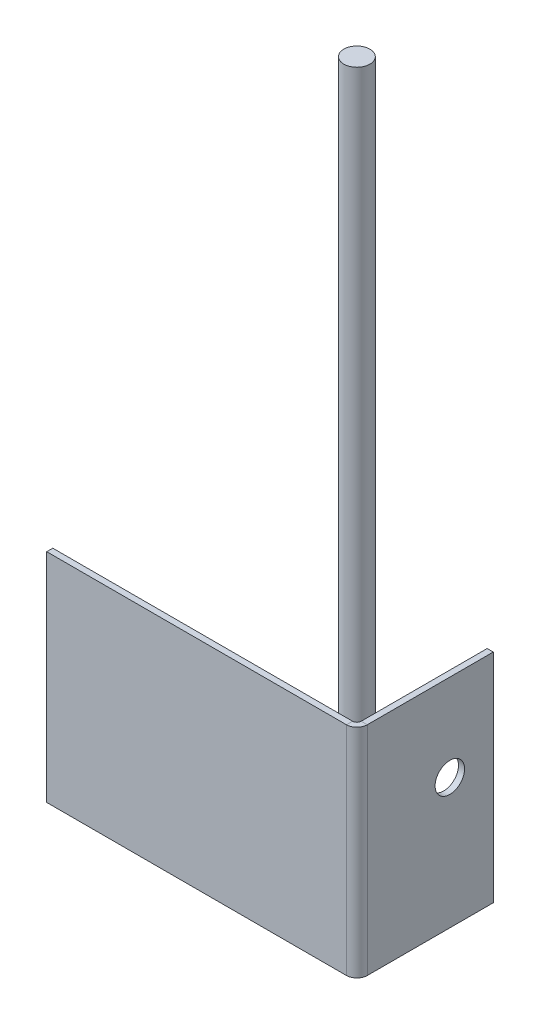
ISO-10303-21;
HEADER;
FILE_DESCRIPTION(('STEP AP214'),'2;1');
FILE_NAME('part.step','',(''),(''),'','','');
FILE_SCHEMA(('AUTOMOTIVE_DESIGN { 1 0 10303 214 1 1 1 1 }'));
ENDSEC;
DATA;
#1=APPLICATION_CONTEXT('core data for automotive mechanical design processes');
#2=APPLICATION_PROTOCOL_DEFINITION('international standard','automotive_design',2000,#1);
#3=PRODUCT_CONTEXT('',#1,'mechanical');
#4=PRODUCT('Part','Part','',(#3));
#5=PRODUCT_RELATED_PRODUCT_CATEGORY('part','',(#4));
#6=PRODUCT_DEFINITION_FORMATION('','',#4);
#7=PRODUCT_DEFINITION_CONTEXT('part definition',#1,'design');
#8=PRODUCT_DEFINITION('design','',#6,#7);
#9=PRODUCT_DEFINITION_SHAPE('','',#8);
#10=(LENGTH_UNIT() NAMED_UNIT(*) SI_UNIT(.MILLI.,.METRE.));
#11=(NAMED_UNIT(*) PLANE_ANGLE_UNIT() SI_UNIT($,.RADIAN.));
#12=(NAMED_UNIT(*) SI_UNIT($,.STERADIAN.) SOLID_ANGLE_UNIT());
#13=UNCERTAINTY_MEASURE_WITH_UNIT(LENGTH_MEASURE(1.E-05),#10,'distance_accuracy_value','');
#14=(GEOMETRIC_REPRESENTATION_CONTEXT(3) GLOBAL_UNCERTAINTY_ASSIGNED_CONTEXT((#13)) GLOBAL_UNIT_ASSIGNED_CONTEXT((#10,
#11,#12)) REPRESENTATION_CONTEXT('',''));
#15=CARTESIAN_POINT('',(0.,0.,0.));
#16=DIRECTION('',(0.,0.,1.));
#17=DIRECTION('',(1.,0.,0.));
#18=AXIS2_PLACEMENT_3D('',#15,#16,#17);
#19=CARTESIAN_POINT('',(16.,77.5,-2.2));
#20=DIRECTION('',(0.,-1.,0.));
#21=DIRECTION('',(0.,0.,-1.));
#22=AXIS2_PLACEMENT_3D('',#19,#20,#21);
#23=CYLINDRICAL_SURFACE('',#22,1.5);
#24=CARTESIAN_POINT('',(16.,77.5,-2.2));
#25=DIRECTION('',(0.,1.,0.));
#26=DIRECTION('',(0.,0.,1.));
#27=AXIS2_PLACEMENT_3D('',#24,#25,#26);
#28=CIRCLE('',#27,1.5);
#29=CARTESIAN_POINT('',(16.,77.5,-3.7));
#30=VERTEX_POINT('',#29);
#31=EDGE_CURVE('E11',#30,#30,#28,.T.);
#32=CARTESIAN_POINT('',(16.,-12.5,-2.2));
#33=DIRECTION('',(0.,1.,0.));
#34=DIRECTION('',(0.,0.,1.));
#35=AXIS2_PLACEMENT_3D('',#32,#33,#34);
#36=CIRCLE('',#35,1.5);
#37=CARTESIAN_POINT('',(16.,-12.5,-3.7));
#38=VERTEX_POINT('',#37);
#39=EDGE_CURVE('E49',#38,#38,#36,.T.);
#40=CARTESIAN_POINT('',(16.,77.5,-3.7));
#41=CARTESIAN_POINT('',(16.,76.5625,-3.7));
#42=CARTESIAN_POINT('',(16.,75.625,-3.7));
#43=CARTESIAN_POINT('',(16.,73.75,-3.7));
#44=CARTESIAN_POINT('',(16.,72.8125,-3.7));
#45=CARTESIAN_POINT('',(16.,70.9375,-3.7));
#46=CARTESIAN_POINT('',(16.,70.,-3.7));
#47=CARTESIAN_POINT('',(16.,68.125,-3.7));
#48=CARTESIAN_POINT('',(16.,67.1875,-3.7));
#49=CARTESIAN_POINT('',(16.,65.3125,-3.7));
#50=CARTESIAN_POINT('',(16.,64.375,-3.7));
#51=CARTESIAN_POINT('',(16.,62.5,-3.7));
#52=CARTESIAN_POINT('',(16.,61.5625,-3.7));
#53=CARTESIAN_POINT('',(16.,59.6875,-3.7));
#54=CARTESIAN_POINT('',(16.,58.75,-3.7));
#55=CARTESIAN_POINT('',(16.,56.875,-3.7));
#56=CARTESIAN_POINT('',(16.,55.9375,-3.7));
#57=CARTESIAN_POINT('',(16.,54.0625,-3.7));
#58=CARTESIAN_POINT('',(16.,53.125,-3.7));
#59=CARTESIAN_POINT('',(16.,51.25,-3.7));
#60=CARTESIAN_POINT('',(16.,50.3125,-3.7));
#61=CARTESIAN_POINT('',(16.,48.4375,-3.7));
#62=CARTESIAN_POINT('',(16.,47.5,-3.7));
#63=CARTESIAN_POINT('',(16.,45.625,-3.7));
#64=CARTESIAN_POINT('',(16.,44.6875,-3.7));
#65=CARTESIAN_POINT('',(16.,42.8125,-3.7));
#66=CARTESIAN_POINT('',(16.,41.875,-3.7));
#67=CARTESIAN_POINT('',(16.,40.,-3.7));
#68=CARTESIAN_POINT('',(16.,39.0625,-3.7));
#69=CARTESIAN_POINT('',(16.,37.1875,-3.7));
#70=CARTESIAN_POINT('',(16.,36.25,-3.7));
#71=CARTESIAN_POINT('',(16.,34.375,-3.7));
#72=CARTESIAN_POINT('',(16.,33.4375,-3.7));
#73=CARTESIAN_POINT('',(16.,31.5625,-3.7));
#74=CARTESIAN_POINT('',(16.,30.625,-3.7));
#75=CARTESIAN_POINT('',(16.,28.75,-3.7));
#76=CARTESIAN_POINT('',(16.,27.8125,-3.7));
#77=CARTESIAN_POINT('',(16.,25.9375,-3.7));
#78=CARTESIAN_POINT('',(16.,25.,-3.7));
#79=CARTESIAN_POINT('',(16.,23.125,-3.7));
#80=CARTESIAN_POINT('',(16.,22.1875,-3.7));
#81=CARTESIAN_POINT('',(16.,20.3125,-3.7));
#82=CARTESIAN_POINT('',(16.,19.375,-3.7));
#83=CARTESIAN_POINT('',(16.,17.5,-3.7));
#84=CARTESIAN_POINT('',(16.,16.5625,-3.7));
#85=CARTESIAN_POINT('',(16.,14.6875,-3.7));
#86=CARTESIAN_POINT('',(16.,13.75,-3.7));
#87=CARTESIAN_POINT('',(16.,11.875,-3.7));
#88=CARTESIAN_POINT('',(16.,10.9375,-3.7));
#89=CARTESIAN_POINT('',(16.,9.0625,-3.7));
#90=CARTESIAN_POINT('',(16.,8.125,-3.7));
#91=CARTESIAN_POINT('',(16.,6.25,-3.7));
#92=CARTESIAN_POINT('',(16.,5.31249999999999,-3.7));
#93=CARTESIAN_POINT('',(16.,3.43749999999999,-3.7));
#94=CARTESIAN_POINT('',(16.,2.49999999999999,-3.7));
#95=CARTESIAN_POINT('',(16.,0.624999999999996,-3.7));
#96=CARTESIAN_POINT('',(16.,-0.312500000000003,-3.7));
#97=CARTESIAN_POINT('',(16.,-2.1875,-3.7));
#98=CARTESIAN_POINT('',(16.,-3.12500000000001,-3.7));
#99=CARTESIAN_POINT('',(16.,-5.00000000000001,-3.7));
#100=CARTESIAN_POINT('',(16.,-5.93750000000001,-3.7));
#101=CARTESIAN_POINT('',(16.,-7.81250000000001,-3.7));
#102=CARTESIAN_POINT('',(16.,-8.75000000000001,-3.7));
#103=CARTESIAN_POINT('',(16.,-10.625,-3.7));
#104=CARTESIAN_POINT('',(16.,-11.5625,-3.7));
#105=CARTESIAN_POINT('',(16.,-12.5,-3.7));
#106=B_SPLINE_CURVE_WITH_KNOTS('',3,(#40,#41,#42,#43,#44,#45,#46,#47,#48,#49,#50,#51,#52,#53,
#54,#55,#56,#57,#58,#59,#60,#61,#62,#63,#64,#65,#66,#67,#68,#69,#70,#71,#72,#73,#74,#75,#76,#77,
#78,#79,#80,#81,#82,#83,#84,#85,#86,#87,#88,#89,#90,#91,#92,#93,#94,#95,#96,#97,#98,#99,#100,
#101,#102,#103,#104,#105),.UNSPECIFIED.,.F.,.F.,(4,2,2,2,2,2,2,2,2,2,2,2,2,2,2,2,2,2,2,2,2,2,2,
2,2,2,2,2,2,2,2,2,4),(0.,2.81250000000001,5.62500000000001,8.4375,11.25,14.0625,16.875,19.6875,
22.5,25.3125,28.125,30.9375,33.75,36.5625,39.375,42.1875,45.,47.8125,50.625,53.4375,56.25,
59.0625,61.875,64.6875,67.5,70.3125,73.125,75.9375,78.75,81.5625,84.375,87.1875,90.),.UNSPECIFIED.);
#107=EDGE_CURVE('BSEAM46',#30,#38,#106,.T.);
#108=ORIENTED_EDGE('',*,*,#31,.F.);
#109=ORIENTED_EDGE('',*,*,#39,.T.);
#110=ORIENTED_EDGE('',*,*,#107,.T.);
#111=ORIENTED_EDGE('',*,*,#107,.F.);
#112=EDGE_LOOP('',(#108,#110,#109,#111));
#113=FACE_BOUND('',#112,.T.);
#114=ADVANCED_FACE('F46',(#113),#23,.T.);
#115=CARTESIAN_POINT('',(16.,77.5,-2.2));
#116=DIRECTION('',(0.,1.,0.));
#117=DIRECTION('',(0.,0.,1.));
#118=AXIS2_PLACEMENT_3D('',#115,#116,#117);
#119=PLANE('',#118);
#120=ORIENTED_EDGE('',*,*,#31,.T.);
#121=EDGE_LOOP('',(#120));
#122=FACE_BOUND('',#121,.T.);
#123=ADVANCED_FACE('F61',(#122),#119,.T.);
#124=CARTESIAN_POINT('',(16.,-12.5,-2.2));
#125=DIRECTION('',(0.,1.,0.));
#126=DIRECTION('',(0.,0.,1.));
#127=AXIS2_PLACEMENT_3D('',#124,#125,#126);
#128=PLANE('',#127);
#129=ORIENTED_EDGE('',*,*,#39,.F.);
#130=EDGE_LOOP('',(#129));
#131=FACE_BOUND('',#130,.T.);
#132=ADVANCED_FACE('F59',(#131),#128,.F.);
#133=CLOSED_SHELL('',(#114,#123,#132));
#134=MANIFOLD_SOLID_BREP('B2',#133);
#135=CARTESIAN_POINT('',(-17.5,-12.5,-0.7));
#136=DIRECTION('',(0.,-1.,0.));
#137=DIRECTION('',(0.,0.,-1.));
#138=AXIS2_PLACEMENT_3D('',#135,#136,#137);
#139=PLANE('',#138);
#140=DIRECTION('',(1.,0.,0.));
#141=VECTOR('',#140,1.);
#142=CARTESIAN_POINT('',(-17.5,-12.5,-0.7));
#143=LINE('',#142,#141);
#144=CARTESIAN_POINT('',(-17.5,-12.5,-0.7));
#145=VERTEX_POINT('',#144);
#146=CARTESIAN_POINT('',(17.,-12.5,-0.700000000000001));
#147=VERTEX_POINT('',#146);
#148=EDGE_CURVE('E145',#145,#147,#143,.T.);
#149=ORIENTED_EDGE('',*,*,#148,.T.);
#150=DIRECTION('',(0.,0.,1.));
#151=VECTOR('',#150,1.);
#152=CARTESIAN_POINT('',(17.,-12.5,-0.700000000000001));
#153=LINE('',#152,#151);
#154=CARTESIAN_POINT('',(17.,-12.5,0.));
#155=VERTEX_POINT('',#154);
#156=EDGE_CURVE('E138',#147,#155,#153,.T.);
#157=ORIENTED_EDGE('',*,*,#156,.T.);
#158=DIRECTION('',(1.,0.,0.));
#159=VECTOR('',#158,1.);
#160=CARTESIAN_POINT('',(-17.5,-12.5,0.));
#161=LINE('',#160,#159);
#162=CARTESIAN_POINT('',(-17.5,-12.5,0.));
#163=VERTEX_POINT('',#162);
#164=EDGE_CURVE('E131',#163,#155,#161,.T.);
#165=ORIENTED_EDGE('',*,*,#164,.F.);
#166=DIRECTION('',(0.,0.,1.));
#167=VECTOR('',#166,1.);
#168=CARTESIAN_POINT('',(-17.5,-12.5,-0.7));
#169=LINE('',#168,#167);
#170=EDGE_CURVE('E44',#145,#163,#169,.T.);
#171=ORIENTED_EDGE('',*,*,#170,.F.);
#172=EDGE_LOOP('',(#149,#157,#165,#171));
#173=FACE_BOUND('',#172,.T.);
#174=ADVANCED_FACE('F86',(#173),#139,.T.);
#175=CARTESIAN_POINT('',(0.,0.,-0.7));
#176=DIRECTION('',(0.,0.,1.));
#177=DIRECTION('',(1.,0.,0.));
#178=AXIS2_PLACEMENT_3D('',#175,#176,#177);
#179=PLANE('',#178);
#180=DIRECTION('',(0.,-1.,0.));
#181=VECTOR('',#180,1.);
#182=CARTESIAN_POINT('',(17.,-12.5,-0.700000000000001));
#183=LINE('',#182,#181);
#184=CARTESIAN_POINT('',(17.,12.5,-0.700000000000001));
#185=VERTEX_POINT('',#184);
#186=EDGE_CURVE('E153',#147,#185,#183,.F.);
#187=ORIENTED_EDGE('',*,*,#186,.F.);
#188=ORIENTED_EDGE('',*,*,#148,.F.);
#189=DIRECTION('',(0.,-1.,0.));
#190=VECTOR('',#189,1.);
#191=CARTESIAN_POINT('',(-17.5,12.5,-0.7));
#192=LINE('',#191,#190);
#193=CARTESIAN_POINT('',(-17.5,12.5,-0.7));
#194=VERTEX_POINT('',#193);
#195=EDGE_CURVE('E125',#194,#145,#192,.T.);
#196=ORIENTED_EDGE('',*,*,#195,.F.);
#197=DIRECTION('',(-1.,0.,0.));
#198=VECTOR('',#197,1.);
#199=CARTESIAN_POINT('',(-17.5,12.5,-0.7));
#200=LINE('',#199,#198);
#201=EDGE_CURVE('E139',#185,#194,#200,.T.);
#202=ORIENTED_EDGE('',*,*,#201,.F.);
#203=EDGE_LOOP('',(#187,#188,#196,#202));
#204=FACE_BOUND('',#203,.T.);
#205=ADVANCED_FACE('F261',(#204),#179,.F.);
#206=CARTESIAN_POINT('',(0.,0.,0.));
#207=DIRECTION('',(0.,0.,1.));
#208=DIRECTION('',(1.,0.,0.));
#209=AXIS2_PLACEMENT_3D('',#206,#207,#208);
#210=PLANE('',#209);
#211=ORIENTED_EDGE('',*,*,#164,.T.);
#212=DIRECTION('',(0.,-1.,0.));
#213=VECTOR('',#212,1.);
#214=CARTESIAN_POINT('',(17.,-12.5,0.));
#215=LINE('',#214,#213);
#216=CARTESIAN_POINT('',(17.,12.5,0.));
#217=VERTEX_POINT('',#216);
#218=EDGE_CURVE('E163',#155,#217,#215,.F.);
#219=ORIENTED_EDGE('',*,*,#218,.T.);
#220=DIRECTION('',(-1.,0.,0.));
#221=VECTOR('',#220,1.);
#222=CARTESIAN_POINT('',(-17.5,12.5,0.));
#223=LINE('',#222,#221);
#224=CARTESIAN_POINT('',(-17.5,12.5,0.));
#225=VERTEX_POINT('',#224);
#226=EDGE_CURVE('E133',#217,#225,#223,.T.);
#227=ORIENTED_EDGE('',*,*,#226,.T.);
#228=DIRECTION('',(0.,-1.,0.));
#229=VECTOR('',#228,1.);
#230=CARTESIAN_POINT('',(-17.5,12.5,0.));
#231=LINE('',#230,#229);
#232=EDGE_CURVE('E123',#225,#163,#231,.T.);
#233=ORIENTED_EDGE('',*,*,#232,.T.);
#234=EDGE_LOOP('',(#211,#219,#227,#233));
#235=FACE_BOUND('',#234,.T.);
#236=ADVANCED_FACE('F129',(#235),#210,.T.);
#237=CARTESIAN_POINT('',(-17.5,12.5,-0.7));
#238=DIRECTION('',(-1.,0.,0.));
#239=DIRECTION('',(0.,-1.,0.));
#240=AXIS2_PLACEMENT_3D('',#237,#238,#239);
#241=PLANE('',#240);
#242=ORIENTED_EDGE('',*,*,#232,.F.);
#243=DIRECTION('',(0.,0.,1.));
#244=VECTOR('',#243,1.);
#245=CARTESIAN_POINT('',(-17.5,12.5,-0.7));
#246=LINE('',#245,#244);
#247=EDGE_CURVE('E90',#194,#225,#246,.T.);
#248=ORIENTED_EDGE('',*,*,#247,.F.);
#249=ORIENTED_EDGE('',*,*,#195,.T.);
#250=ORIENTED_EDGE('',*,*,#170,.T.);
#251=EDGE_LOOP('',(#242,#248,#249,#250));
#252=FACE_BOUND('',#251,.T.);
#253=ADVANCED_FACE('F121',(#252),#241,.T.);
#254=CARTESIAN_POINT('',(-17.5,12.5,-0.7));
#255=DIRECTION('',(0.,1.,0.));
#256=DIRECTION('',(0.,0.,1.));
#257=AXIS2_PLACEMENT_3D('',#254,#255,#256);
#258=PLANE('',#257);
#259=DIRECTION('',(0.,0.,1.));
#260=VECTOR('',#259,1.);
#261=CARTESIAN_POINT('',(17.,12.5,-0.700000000000001));
#262=LINE('',#261,#260);
#263=EDGE_CURVE('E144',#185,#217,#262,.T.);
#264=ORIENTED_EDGE('',*,*,#263,.F.);
#265=ORIENTED_EDGE('',*,*,#201,.T.);
#266=ORIENTED_EDGE('',*,*,#247,.T.);
#267=ORIENTED_EDGE('',*,*,#226,.F.);
#268=EDGE_LOOP('',(#264,#265,#266,#267));
#269=FACE_BOUND('',#268,.T.);
#270=ADVANCED_FACE('F88',(#269),#258,.T.);
#271=CARTESIAN_POINT('',(17.,12.5,-1.2));
#272=DIRECTION('',(0.,1.,0.));
#273=DIRECTION('',(0.,0.,1.));
#274=AXIS2_PLACEMENT_3D('',#271,#272,#273);
#275=PLANE('',#274);
#276=DIRECTION('',(1.,0.,0.));
#277=VECTOR('',#276,1.);
#278=CARTESIAN_POINT('',(17.5,12.5,-1.2));
#279=LINE('',#278,#277);
#280=CARTESIAN_POINT('',(17.5,12.5,-1.2));
#281=VERTEX_POINT('',#280);
#282=CARTESIAN_POINT('',(18.2,12.5,-1.19999999999999));
#283=VERTEX_POINT('',#282);
#284=EDGE_CURVE('E192',#281,#283,#279,.T.);
#285=ORIENTED_EDGE('',*,*,#284,.F.);
#286=CARTESIAN_POINT('',(17.,12.5,-1.2));
#287=DIRECTION('',(0.,-1.,0.));
#288=DIRECTION('',(0.,0.,-1.));
#289=AXIS2_PLACEMENT_3D('',#286,#287,#288);
#290=CIRCLE('',#289,0.499999999999997);
#291=EDGE_CURVE('E157',#185,#281,#290,.F.);
#292=ORIENTED_EDGE('',*,*,#291,.F.);
#293=ORIENTED_EDGE('',*,*,#263,.T.);
#294=CARTESIAN_POINT('',(17.,12.5,-1.2));
#295=DIRECTION('',(0.,-1.,0.));
#296=DIRECTION('',(0.,0.,-1.));
#297=AXIS2_PLACEMENT_3D('',#294,#295,#296);
#298=CIRCLE('',#297,1.2);
#299=EDGE_CURVE('E101',#217,#283,#298,.F.);
#300=ORIENTED_EDGE('',*,*,#299,.T.);
#301=EDGE_LOOP('',(#285,#292,#293,#300));
#302=FACE_BOUND('',#301,.T.);
#303=ADVANCED_FACE('F265',(#302),#275,.T.);
#304=CARTESIAN_POINT('',(17.,-12.5,-1.2));
#305=DIRECTION('',(0.,1.,0.));
#306=DIRECTION('',(0.,0.,1.));
#307=AXIS2_PLACEMENT_3D('',#304,#305,#306);
#308=PLANE('',#307);
#309=CARTESIAN_POINT('',(17.,-12.5,-1.2));
#310=DIRECTION('',(0.,-1.,0.));
#311=DIRECTION('',(0.,0.,-1.));
#312=AXIS2_PLACEMENT_3D('',#309,#310,#311);
#313=CIRCLE('',#312,0.499999999999997);
#314=CARTESIAN_POINT('',(17.5,-12.5,-1.2));
#315=VERTEX_POINT('',#314);
#316=EDGE_CURVE('E150',#315,#147,#313,.T.);
#317=ORIENTED_EDGE('',*,*,#316,.F.);
#318=DIRECTION('',(1.,0.,0.));
#319=VECTOR('',#318,1.);
#320=CARTESIAN_POINT('',(17.5,-12.5,-1.2));
#321=LINE('',#320,#319);
#322=CARTESIAN_POINT('',(18.2,-12.5,-1.19999999999999));
#323=VERTEX_POINT('',#322);
#324=EDGE_CURVE('E191',#315,#323,#321,.T.);
#325=ORIENTED_EDGE('',*,*,#324,.T.);
#326=CARTESIAN_POINT('',(17.,-12.5,-1.2));
#327=DIRECTION('',(0.,-1.,0.));
#328=DIRECTION('',(0.,0.,-1.));
#329=AXIS2_PLACEMENT_3D('',#326,#327,#328);
#330=CIRCLE('',#329,1.2);
#331=EDGE_CURVE('E160',#323,#155,#330,.T.);
#332=ORIENTED_EDGE('',*,*,#331,.T.);
#333=ORIENTED_EDGE('',*,*,#156,.F.);
#334=EDGE_LOOP('',(#317,#325,#332,#333));
#335=FACE_BOUND('',#334,.T.);
#336=ADVANCED_FACE('F253',(#335),#308,.F.);
#337=CARTESIAN_POINT('',(17.,-12.5,-1.2));
#338=DIRECTION('',(0.,-1.,0.));
#339=DIRECTION('',(1.,0.,0.));
#340=AXIS2_PLACEMENT_3D('',#337,#338,#339);
#341=CYLINDRICAL_SURFACE('',#340,1.2);
#342=ORIENTED_EDGE('',*,*,#218,.F.);
#343=ORIENTED_EDGE('',*,*,#331,.F.);
#344=DIRECTION('',(0.,1.,0.));
#345=VECTOR('',#344,1.);
#346=CARTESIAN_POINT('',(18.2,0.,-1.19999999999999));
#347=LINE('',#346,#345);
#348=EDGE_CURVE('E182',#323,#283,#347,.T.);
#349=ORIENTED_EDGE('',*,*,#348,.T.);
#350=ORIENTED_EDGE('',*,*,#299,.F.);
#351=EDGE_LOOP('',(#342,#343,#349,#350));
#352=FACE_BOUND('',#351,.T.);
#353=ADVANCED_FACE('F266',(#352),#341,.T.);
#354=CARTESIAN_POINT('',(17.,-12.5,-1.2));
#355=DIRECTION('',(0.,-1.,0.));
#356=DIRECTION('',(1.,0.,0.));
#357=AXIS2_PLACEMENT_3D('',#354,#355,#356);
#358=CYLINDRICAL_SURFACE('',#357,0.499999999999997);
#359=ORIENTED_EDGE('',*,*,#186,.T.);
#360=ORIENTED_EDGE('',*,*,#291,.T.);
#361=DIRECTION('',(0.,-1.,0.));
#362=VECTOR('',#361,1.);
#363=CARTESIAN_POINT('',(17.5,12.5,-1.2));
#364=LINE('',#363,#362);
#365=EDGE_CURVE('E195',#281,#315,#364,.T.);
#366=ORIENTED_EDGE('',*,*,#365,.T.);
#367=ORIENTED_EDGE('',*,*,#316,.T.);
#368=EDGE_LOOP('',(#359,#360,#366,#367));
#369=FACE_BOUND('',#368,.T.);
#370=ADVANCED_FACE('F257',(#369),#358,.F.);
#371=CARTESIAN_POINT('',(18.2000000000001,-12.5,-15.7));
#372=DIRECTION('',(0.,1.,0.));
#373=DIRECTION('',(-1.,0.,0.));
#374=AXIS2_PLACEMENT_3D('',#371,#372,#373);
#375=PLANE('',#374);
#376=ORIENTED_EDGE('',*,*,#324,.F.);
#377=DIRECTION('',(0.,0.,-1.));
#378=VECTOR('',#377,1.);
#379=CARTESIAN_POINT('',(17.5000000000001,-12.5,-15.7));
#380=LINE('',#379,#378);
#381=CARTESIAN_POINT('',(17.5000000000001,-12.5,-15.7));
#382=VERTEX_POINT('',#381);
#383=EDGE_CURVE('E179',#315,#382,#380,.T.);
#384=ORIENTED_EDGE('',*,*,#383,.T.);
#385=DIRECTION('',(-1.,0.,0.));
#386=VECTOR('',#385,1.);
#387=CARTESIAN_POINT('',(18.2000000000001,-12.5,-15.7));
#388=LINE('',#387,#386);
#389=CARTESIAN_POINT('',(18.2000000000001,-12.5,-15.7));
#390=VERTEX_POINT('',#389);
#391=EDGE_CURVE('E154',#390,#382,#388,.T.);
#392=ORIENTED_EDGE('',*,*,#391,.F.);
#393=DIRECTION('',(0.,0.,-1.));
#394=VECTOR('',#393,1.);
#395=CARTESIAN_POINT('',(18.2000000000001,-12.5,-15.7));
#396=LINE('',#395,#394);
#397=EDGE_CURVE('E175',#323,#390,#396,.T.);
#398=ORIENTED_EDGE('',*,*,#397,.F.);
#399=EDGE_LOOP('',(#376,#384,#392,#398));
#400=FACE_BOUND('',#399,.T.);
#401=ADVANCED_FACE('F226',(#400),#375,.F.);
#402=CARTESIAN_POINT('',(18.2,12.5,-0.699999999999998));
#403=DIRECTION('',(0.,-1.,0.));
#404=DIRECTION('',(1.,0.,0.));
#405=AXIS2_PLACEMENT_3D('',#402,#403,#404);
#406=PLANE('',#405);
#407=ORIENTED_EDGE('',*,*,#284,.T.);
#408=DIRECTION('',(0.,0.,1.));
#409=VECTOR('',#408,1.);
#410=CARTESIAN_POINT('',(18.2,12.5,-0.699999999999998));
#411=LINE('',#410,#409);
#412=CARTESIAN_POINT('',(18.2000000000001,12.5,-15.7));
#413=VERTEX_POINT('',#412);
#414=EDGE_CURVE('E171',#413,#283,#411,.T.);
#415=ORIENTED_EDGE('',*,*,#414,.F.);
#416=DIRECTION('',(-1.,0.,0.));
#417=VECTOR('',#416,1.);
#418=CARTESIAN_POINT('',(18.2000000000001,12.5,-15.7));
#419=LINE('',#418,#417);
#420=CARTESIAN_POINT('',(17.5000000000001,12.5,-15.7));
#421=VERTEX_POINT('',#420);
#422=EDGE_CURVE('E168',#413,#421,#419,.T.);
#423=ORIENTED_EDGE('',*,*,#422,.T.);
#424=DIRECTION('',(0.,0.,1.));
#425=VECTOR('',#424,1.);
#426=CARTESIAN_POINT('',(17.5,12.5,-0.7));
#427=LINE('',#426,#425);
#428=EDGE_CURVE('E172',#421,#281,#427,.T.);
#429=ORIENTED_EDGE('',*,*,#428,.T.);
#430=EDGE_LOOP('',(#407,#415,#423,#429));
#431=FACE_BOUND('',#430,.T.);
#432=ADVANCED_FACE('F359',(#431),#406,.F.);
#433=CARTESIAN_POINT('',(18.2,0.,0.));
#434=DIRECTION('',(-1.,0.,0.));
#435=DIRECTION('',(0.,0.,1.));
#436=AXIS2_PLACEMENT_3D('',#433,#434,#435);
#437=PLANE('',#436);
#438=CARTESIAN_POINT('',(18.2,2.5,-10.6999999999999));
#439=DIRECTION('',(-1.,0.,0.));
#440=DIRECTION('',(0.,0.,1.));
#441=AXIS2_PLACEMENT_3D('',#438,#439,#440);
#442=CIRCLE('',#441,1.69599373528133);
#443=CARTESIAN_POINT('',(18.2,2.5,-9.00400626471855));
#444=VERTEX_POINT('',#443);
#445=EDGE_CURVE('E196',#444,#444,#442,.F.);
#446=ORIENTED_EDGE('',*,*,#445,.F.);
#447=EDGE_LOOP('',(#446));
#448=FACE_BOUND('',#447,.T.);
#449=ORIENTED_EDGE('',*,*,#348,.F.);
#450=ORIENTED_EDGE('',*,*,#397,.T.);
#451=DIRECTION('',(0.,1.,0.));
#452=VECTOR('',#451,1.);
#453=CARTESIAN_POINT('',(18.2000000000001,12.5,-15.7));
#454=LINE('',#453,#452);
#455=EDGE_CURVE('E185',#390,#413,#454,.T.);
#456=ORIENTED_EDGE('',*,*,#455,.T.);
#457=ORIENTED_EDGE('',*,*,#414,.T.);
#458=EDGE_LOOP('',(#449,#450,#456,#457));
#459=FACE_BOUND('',#458,.T.);
#460=ADVANCED_FACE('F213',(#448,#459),#437,.F.);
#461=CARTESIAN_POINT('',(17.5,0.,0.));
#462=DIRECTION('',(-1.,0.,0.));
#463=DIRECTION('',(0.,0.,1.));
#464=AXIS2_PLACEMENT_3D('',#461,#462,#463);
#465=PLANE('',#464);
#466=CARTESIAN_POINT('',(17.5,2.5,-10.6999999999999));
#467=DIRECTION('',(-1.,0.,0.));
#468=DIRECTION('',(0.,0.,1.));
#469=AXIS2_PLACEMENT_3D('',#466,#467,#468);
#470=CIRCLE('',#469,1.69599373528133);
#471=CARTESIAN_POINT('',(17.5,2.5,-9.00400626471855));
#472=VERTEX_POINT('',#471);
#473=EDGE_CURVE('E203',#472,#472,#470,.T.);
#474=ORIENTED_EDGE('',*,*,#473,.F.);
#475=EDGE_LOOP('',(#474));
#476=FACE_BOUND('',#475,.T.);
#477=ORIENTED_EDGE('',*,*,#383,.F.);
#478=ORIENTED_EDGE('',*,*,#365,.F.);
#479=ORIENTED_EDGE('',*,*,#428,.F.);
#480=DIRECTION('',(0.,1.,0.));
#481=VECTOR('',#480,1.);
#482=CARTESIAN_POINT('',(17.5000000000001,12.5,-15.7));
#483=LINE('',#482,#481);
#484=EDGE_CURVE('E176',#382,#421,#483,.T.);
#485=ORIENTED_EDGE('',*,*,#484,.F.);
#486=EDGE_LOOP('',(#477,#478,#479,#485));
#487=FACE_BOUND('',#486,.T.);
#488=ADVANCED_FACE('F209',(#476,#487),#465,.T.);
#489=CARTESIAN_POINT('',(18.2000000000001,12.5,-15.7));
#490=DIRECTION('',(0.,0.,1.));
#491=DIRECTION('',(1.,0.,0.));
#492=AXIS2_PLACEMENT_3D('',#489,#490,#491);
#493=PLANE('',#492);
#494=ORIENTED_EDGE('',*,*,#484,.T.);
#495=ORIENTED_EDGE('',*,*,#422,.F.);
#496=ORIENTED_EDGE('',*,*,#455,.F.);
#497=ORIENTED_EDGE('',*,*,#391,.T.);
#498=EDGE_LOOP('',(#494,#495,#496,#497));
#499=FACE_BOUND('',#498,.T.);
#500=ADVANCED_FACE('F212',(#499),#493,.F.);
#501=CARTESIAN_POINT('',(22.9969946842694,2.5,-10.6999999999999));
#502=DIRECTION('',(-1.,0.,0.));
#503=DIRECTION('',(0.,0.,1.));
#504=AXIS2_PLACEMENT_3D('',#501,#502,#503);
#505=CYLINDRICAL_SURFACE('',#504,1.69599373528133);
#506=ORIENTED_EDGE('',*,*,#445,.T.);
#507=EDGE_LOOP('',(#506));
#508=FACE_BOUND('',#507,.T.);
#509=ORIENTED_EDGE('',*,*,#473,.T.);
#510=EDGE_LOOP('',(#509));
#511=FACE_BOUND('',#510,.T.);
#512=ADVANCED_FACE('F207',(#508,#511),#505,.F.);
#513=CLOSED_SHELL('',(#174,#205,#236,#253,#270,#303,#336,#353,#370,#401,#432,#460,#488,#500,#512));
#514=MANIFOLD_SOLID_BREP('B6',#513);
#515=ADVANCED_BREP_SHAPE_REPRESENTATION('',(#18,#134,#514),#14);
#516=SHAPE_DEFINITION_REPRESENTATION(#9,#515);
ENDSEC;
END-ISO-10303-21;
